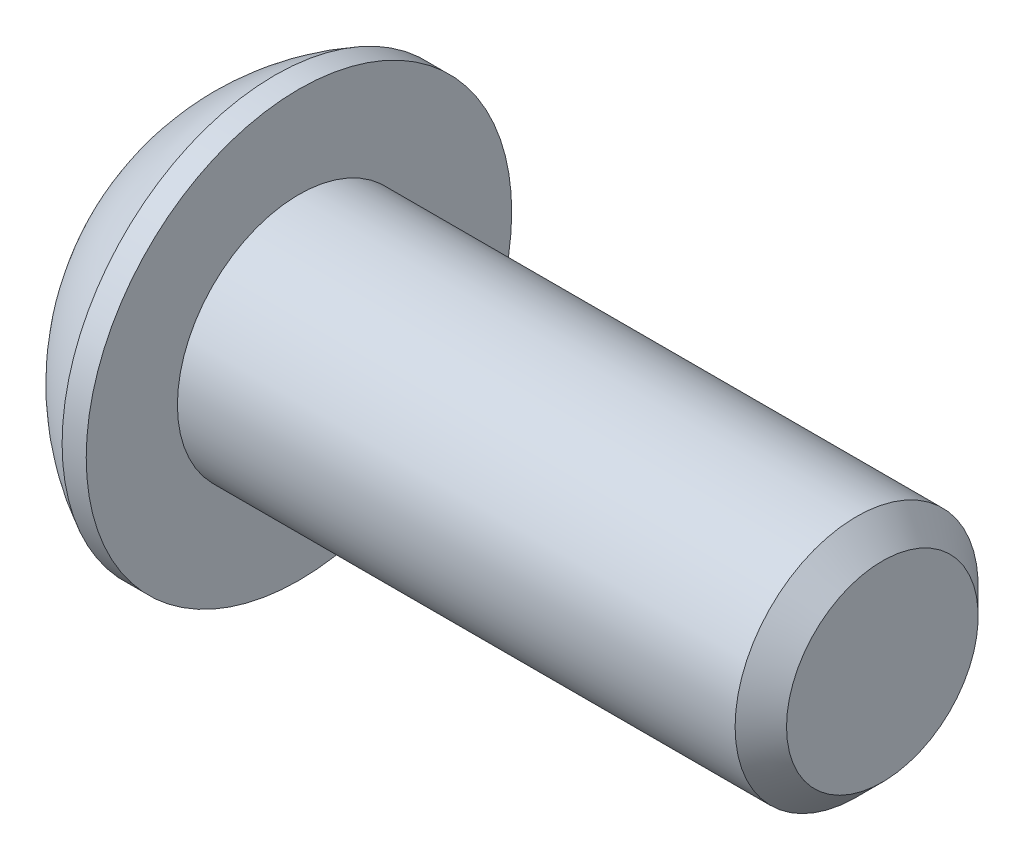
ISO-10303-21;
HEADER;
FILE_DESCRIPTION(('STEP AP214'),'2;1');
FILE_NAME('part.step','',(''),(''),'','','');
FILE_SCHEMA(('AUTOMOTIVE_DESIGN { 1 0 10303 214 1 1 1 1 }'));
ENDSEC;
DATA;
#1=APPLICATION_CONTEXT('core data for automotive mechanical design processes');
#2=APPLICATION_PROTOCOL_DEFINITION('international standard','automotive_design',2000,#1);
#3=PRODUCT_CONTEXT('',#1,'mechanical');
#4=PRODUCT('Part','Part','',(#3));
#5=PRODUCT_RELATED_PRODUCT_CATEGORY('part','',(#4));
#6=PRODUCT_DEFINITION_FORMATION('','',#4);
#7=PRODUCT_DEFINITION_CONTEXT('part definition',#1,'design');
#8=PRODUCT_DEFINITION('design','',#6,#7);
#9=PRODUCT_DEFINITION_SHAPE('','',#8);
#10=(LENGTH_UNIT() NAMED_UNIT(*) SI_UNIT(.MILLI.,.METRE.));
#11=(NAMED_UNIT(*) PLANE_ANGLE_UNIT() SI_UNIT($,.RADIAN.));
#12=(NAMED_UNIT(*) SI_UNIT($,.STERADIAN.) SOLID_ANGLE_UNIT());
#13=UNCERTAINTY_MEASURE_WITH_UNIT(LENGTH_MEASURE(1.E-05),#10,'distance_accuracy_value','');
#14=(GEOMETRIC_REPRESENTATION_CONTEXT(3) GLOBAL_UNCERTAINTY_ASSIGNED_CONTEXT((#13)) GLOBAL_UNIT_ASSIGNED_CONTEXT((#10,
#11,#12)) REPRESENTATION_CONTEXT('',''));
#15=CARTESIAN_POINT('',(0.,0.,0.));
#16=DIRECTION('',(0.,0.,1.));
#17=DIRECTION('',(1.,0.,0.));
#18=AXIS2_PLACEMENT_3D('',#15,#16,#17);
#19=CARTESIAN_POINT('',(0.,0.,0.));
#20=DIRECTION('',(-1.,0.,0.));
#21=DIRECTION('',(0.,0.,1.));
#22=AXIS2_PLACEMENT_3D('',#19,#20,#21);
#23=PLANE('',#22);
#24=CARTESIAN_POINT('',(0.,0.,0.));
#25=DIRECTION('',(-1.,0.,0.));
#26=DIRECTION('',(0.,0.,1.));
#27=AXIS2_PLACEMENT_3D('',#24,#25,#26);
#28=CIRCLE('',#27,3.47345);
#29=CARTESIAN_POINT('',(0.,3.47345,0.));
#30=VERTEX_POINT('',#29);
#31=EDGE_CURVE('E11',#30,#30,#28,.T.);
#32=ORIENTED_EDGE('',*,*,#31,.T.);
#33=EDGE_LOOP('',(#32));
#34=FACE_BOUND('',#33,.T.);
#35=DIRECTION('',(0.,-1.,0.));
#36=VECTOR('',#35,1.);
#37=CARTESIAN_POINT('',(0.,-1.37848150271715,2.3876));
#38=LINE('',#37,#36);
#39=CARTESIAN_POINT('',(0.,1.37848150271715,2.3876));
#40=VERTEX_POINT('',#39);
#41=CARTESIAN_POINT('',(0.,-1.37848150271715,2.3876));
#42=VERTEX_POINT('',#41);
#43=EDGE_CURVE('E49',#40,#42,#38,.T.);
#44=ORIENTED_EDGE('',*,*,#43,.T.);
#45=DIRECTION('',(0.,-0.5,-0.866025403784439));
#46=VECTOR('',#45,1.);
#47=CARTESIAN_POINT('',(0.,-2.7569630054343,0.));
#48=LINE('',#47,#46);
#49=CARTESIAN_POINT('',(0.,-2.7569630054343,0.));
#50=VERTEX_POINT('',#49);
#51=EDGE_CURVE('E106',#42,#50,#48,.T.);
#52=ORIENTED_EDGE('',*,*,#51,.T.);
#53=DIRECTION('',(0.,0.5,-0.866025403784439));
#54=VECTOR('',#53,1.);
#55=CARTESIAN_POINT('',(0.,-1.37848150271715,-2.3876));
#56=LINE('',#55,#54);
#57=CARTESIAN_POINT('',(0.,-1.37848150271715,-2.3876));
#58=VERTEX_POINT('',#57);
#59=EDGE_CURVE('E108',#50,#58,#56,.T.);
#60=ORIENTED_EDGE('',*,*,#59,.T.);
#61=DIRECTION('',(0.,1.,0.));
#62=VECTOR('',#61,1.);
#63=CARTESIAN_POINT('',(0.,1.37848150271715,-2.3876));
#64=LINE('',#63,#62);
#65=CARTESIAN_POINT('',(0.,1.37848150271715,-2.3876));
#66=VERTEX_POINT('',#65);
#67=EDGE_CURVE('E123',#58,#66,#64,.T.);
#68=ORIENTED_EDGE('',*,*,#67,.T.);
#69=DIRECTION('',(0.,0.5,0.866025403784439));
#70=VECTOR('',#69,1.);
#71=CARTESIAN_POINT('',(0.,2.7569630054343,0.));
#72=LINE('',#71,#70);
#73=CARTESIAN_POINT('',(0.,2.7569630054343,0.));
#74=VERTEX_POINT('',#73);
#75=EDGE_CURVE('E382',#66,#74,#72,.T.);
#76=ORIENTED_EDGE('',*,*,#75,.T.);
#77=DIRECTION('',(0.,-0.5,0.866025403784439));
#78=VECTOR('',#77,1.);
#79=CARTESIAN_POINT('',(0.,1.37848150271715,2.3876));
#80=LINE('',#79,#78);
#81=EDGE_CURVE('E383',#74,#40,#80,.T.);
#82=ORIENTED_EDGE('',*,*,#81,.T.);
#83=EDGE_LOOP('',(#44,#52,#60,#68,#76,#82));
#84=FACE_BOUND('',#83,.T.);
#85=ADVANCED_FACE('F35',(#34,#84),#23,.T.);
#86=CARTESIAN_POINT('',(6.99221430555556,0.,0.));
#87=DIRECTION('',(-1.,0.,0.));
#88=DIRECTION('',(0.,1.,0.));
#89=AXIS2_PLACEMENT_3D('',#86,#87,#88);
#90=SPHERICAL_SURFACE('',#89,7.80742696394375);
#91=CARTESIAN_POINT('',(3.429,0.,0.));
#92=DIRECTION('',(-1.,0.,0.));
#93=DIRECTION('',(0.,0.,1.));
#94=AXIS2_PLACEMENT_3D('',#91,#92,#93);
#95=CIRCLE('',#94,6.9469);
#96=CARTESIAN_POINT('',(3.429,6.9469,0.));
#97=VERTEX_POINT('',#96);
#98=EDGE_CURVE('E42',#97,#97,#95,.T.);
#99=CARTESIAN_POINT('',(3.429,6.9469,0.));
#100=CARTESIAN_POINT('',(3.38299028042981,6.9233007078748,0.));
#101=CARTESIAN_POINT('',(3.33721507803448,6.89924420277975,0.));
#102=CARTESIAN_POINT('',(3.24615162668048,6.8502265451056,0.));
#103=CARTESIAN_POINT('',(3.20086337772181,6.82526539252651,0.));
#104=CARTESIAN_POINT('',(3.11079175232804,6.77444821833994,0.));
#105=CARTESIAN_POINT('',(3.06600837589294,6.74859219673246,0.));
#106=CARTESIAN_POINT('',(2.97696416381529,6.69599551190484,0.));
#107=CARTESIAN_POINT('',(2.93270332817274,6.66925484868469,0.));
#108=CARTESIAN_POINT('',(2.84472167346736,6.61489943163715,0.));
#109=CARTESIAN_POINT('',(2.80100085440453,6.58728467780976,0.));
#110=CARTESIAN_POINT('',(2.71411649176496,6.53119198248872,0.));
#111=CARTESIAN_POINT('',(2.67095294818821,6.50271404099508,0.));
#112=CARTESIAN_POINT('',(2.58520017642221,6.44490621220259,0.));
#113=CARTESIAN_POINT('',(2.54261094823296,6.41557632490374,0.));
#114=CARTESIAN_POINT('',(2.45802362015506,6.35607618317822,0.));
#115=CARTESIAN_POINT('',(2.41602552026642,6.32590592875154,0.));
#116=CARTESIAN_POINT('',(2.33263702841404,6.26473696306766,0.));
#117=CARTESIAN_POINT('',(2.29124663645031,6.23373825181047,0.));
#118=CARTESIAN_POINT('',(2.20908990014782,6.17092460984857,0.));
#119=CARTESIAN_POINT('',(2.16832355580907,6.13910967914387,0.));
#120=CARTESIAN_POINT('',(2.08743100810617,6.07467615787982,0.));
#121=CARTESIAN_POINT('',(2.04730480474203,6.04205756732047,0.));
#122=CARTESIAN_POINT('',(1.96770837962786,5.97602960320368,0.));
#123=CARTESIAN_POINT('',(1.92823815787784,5.94262022964625,0.));
#124=CARTESIAN_POINT('',(1.84996927766961,5.87502388856695,0.));
#125=CARTESIAN_POINT('',(1.81117061921141,5.84083692104508,0.));
#126=CARTESIAN_POINT('',(1.7342601821511,5.77169888804188,0.));
#127=CARTESIAN_POINT('',(1.69614840354898,5.73674782256055,0.));
#128=CARTESIAN_POINT('',(1.62062677160525,5.66609539128663,0.));
#129=CARTESIAN_POINT('',(1.58321691826364,5.63039402549405,0.));
#130=CARTESIAN_POINT('',(1.50911390514594,5.55825508744226,0.));
#131=CARTESIAN_POINT('',(1.47242074536987,5.52181751518306,0.));
#132=CARTESIAN_POINT('',(1.39976560475885,5.44822054867524,0.));
#133=CARTESIAN_POINT('',(1.36380362392392,5.41106115442662,0.));
#134=CARTESIAN_POINT('',(1.29262503792293,5.33603521337114,0.));
#135=CARTESIAN_POINT('',(1.25740843275688,5.29816866656429,0.));
#136=CARTESIAN_POINT('',(1.18773450056911,5.22174336898649,0.));
#137=CARTESIAN_POINT('',(1.1532771735474,5.18318461821554,0.));
#138=CARTESIAN_POINT('',(1.08513540038319,5.10539013456538,0.));
#139=CARTESIAN_POINT('',(1.05145095424068,5.06615440168615,0.));
#140=CARTESIAN_POINT('',(0.984868240459227,4.98702144292777,0.));
#141=CARTESIAN_POINT('',(0.951969972820287,4.9471242170486,0.));
#142=CARTESIAN_POINT('',(0.886972603310109,4.86668402253665,0.));
#143=CARTESIAN_POINT('',(0.854873501438872,4.82614105390387,0.));
#144=CARTESIAN_POINT('',(0.791487135241879,4.74442537905081,0.));
#145=CARTESIAN_POINT('',(0.760199870916124,4.70325267283054,0.));
#146=CARTESIAN_POINT('',(0.698449531095837,4.62029377657177,0.));
#147=CARTESIAN_POINT('',(0.667986455601305,4.57850758653328,0.));
#148=CARTESIAN_POINT('',(0.607896519373352,4.49433821858763,0.));
#149=CARTESIAN_POINT('',(0.578269658639931,4.45195504068048,0.));
#150=CARTESIAN_POINT('',(0.519863847715544,4.36660842863888,0.));
#151=CARTESIAN_POINT('',(0.491084897524578,4.32364499450442,0.));
#152=CARTESIAN_POINT('',(0.434386268869488,4.23715483064814,0.));
#153=CARTESIAN_POINT('',(0.406466590405363,4.19362810092632,0.));
#154=CARTESIAN_POINT('',(0.351497526676594,4.10602852916683,0.));
#155=CARTESIAN_POINT('',(0.32444814141195,4.06195568712916,0.));
#156=CARTESIAN_POINT('',(0.271230343842259,3.9732812886314,0.));
#157=CARTESIAN_POINT('',(0.245061931537212,3.92867973217131,0.));
#158=CARTESIAN_POINT('',(0.193616404947283,3.83896551505233,0.));
#159=CARTESIAN_POINT('',(0.1683392906624,3.79385285439345,0.));
#160=CARTESIAN_POINT('',(0.118686359131506,3.70313422739892,0.));
#161=CARTESIAN_POINT('',(0.0943105418854947,3.65752826106327,0.));
#162=CARTESIAN_POINT('',(0.0464697512979692,3.56584106625221,0.));
#163=CARTESIAN_POINT('',(0.0230047779564549,3.51975983777679,0.));
#164=CARTESIAN_POINT('',(0.,3.47345,0.));
#165=B_SPLINE_CURVE_WITH_KNOTS('',3,(#99,#100,#101,#102,#103,#104,#105,#106,#107,#108,#109,#110,
#111,#112,#113,#114,#115,#116,#117,#118,#119,#120,#121,#122,#123,#124,#125,#126,#127,#128,#129,
#130,#131,#132,#133,#134,#135,#136,#137,#138,#139,#140,#141,#142,#143,#144,#145,#146,#147,#148,
#149,#150,#151,#152,#153,#154,#155,#156,#157,#158,#159,#160,#161,#162,#163,#164),.UNSPECIFIED.,
.F.,.F.,(4,2,2,2,2,2,2,2,2,2,2,2,2,2,2,2,2,2,2,2,2,2,2,2,2,2,2,2,2,2,2,2,4),(0.,
0.155124449954781,0.310248899909562,0.465373349864342,0.620497799819123,0.775622249773904,
0.930746699728683,1.08587114968346,1.24099559963825,1.39612004959303,1.55124449954781,
1.70636894950259,1.86149339945737,2.01661784941215,2.17174229936693,2.32686674932171,
2.48199119927649,2.63711564923127,2.79224009918605,2.94736454914083,3.10248899909561,
3.25761344905039,3.41273789900518,3.56786234895996,3.72298679891474,3.87811124886952,
4.0332356988243,4.18836014877908,4.34348459873386,4.49860904868864,4.65373349864342,
4.8088579485982,4.96398239855298),.UNSPECIFIED.);
#166=EDGE_CURVE('BSEAM156',#97,#30,#165,.T.);
#167=ORIENTED_EDGE('',*,*,#98,.T.);
#168=ORIENTED_EDGE('',*,*,#31,.F.);
#169=ORIENTED_EDGE('',*,*,#166,.T.);
#170=ORIENTED_EDGE('',*,*,#166,.F.);
#171=EDGE_LOOP('',(#167,#169,#168,#170));
#172=FACE_BOUND('',#171,.T.);
#173=ADVANCED_FACE('F156',(#172),#90,.T.);
#174=CARTESIAN_POINT('',(0.,0.,0.));
#175=DIRECTION('',(-1.,0.,0.));
#176=DIRECTION('',(0.,0.,1.));
#177=AXIS2_PLACEMENT_3D('',#174,#175,#176);
#178=CYLINDRICAL_SURFACE('',#177,6.9469);
#179=ORIENTED_EDGE('',*,*,#98,.F.);
#180=EDGE_LOOP('',(#179));
#181=FACE_BOUND('',#180,.T.);
#182=CARTESIAN_POINT('',(4.2164,0.,0.));
#183=DIRECTION('',(-1.,0.,0.));
#184=DIRECTION('',(0.,0.,1.));
#185=AXIS2_PLACEMENT_3D('',#182,#183,#184);
#186=CIRCLE('',#185,6.9469);
#187=CARTESIAN_POINT('',(4.2164,0.,6.9469));
#188=VERTEX_POINT('',#187);
#189=EDGE_CURVE('E151',#188,#188,#186,.T.);
#190=ORIENTED_EDGE('',*,*,#189,.T.);
#191=EDGE_LOOP('',(#190));
#192=FACE_BOUND('',#191,.T.);
#193=ADVANCED_FACE('F159',(#181,#192),#178,.T.);
#194=CARTESIAN_POINT('',(4.2164,3.96875,0.));
#195=DIRECTION('',(-1.,0.,0.));
#196=DIRECTION('',(0.,0.,1.));
#197=AXIS2_PLACEMENT_3D('',#194,#195,#196);
#198=PLANE('',#197);
#199=ORIENTED_EDGE('',*,*,#189,.F.);
#200=EDGE_LOOP('',(#199));
#201=FACE_BOUND('',#200,.T.);
#202=CARTESIAN_POINT('',(4.2164,0.,0.));
#203=DIRECTION('',(-1.,0.,0.));
#204=DIRECTION('',(0.,0.,1.));
#205=AXIS2_PLACEMENT_3D('',#202,#203,#204);
#206=CIRCLE('',#205,3.96875);
#207=CARTESIAN_POINT('',(4.2164,0.,3.96875));
#208=VERTEX_POINT('',#207);
#209=EDGE_CURVE('E148',#208,#208,#206,.T.);
#210=ORIENTED_EDGE('',*,*,#209,.T.);
#211=EDGE_LOOP('',(#210));
#212=FACE_BOUND('',#211,.T.);
#213=ADVANCED_FACE('F162',(#201,#212),#198,.F.);
#214=CARTESIAN_POINT('',(0.,0.,0.));
#215=DIRECTION('',(-1.,0.,0.));
#216=DIRECTION('',(0.,0.,1.));
#217=AXIS2_PLACEMENT_3D('',#214,#215,#216);
#218=CYLINDRICAL_SURFACE('',#217,3.96875);
#219=ORIENTED_EDGE('',*,*,#209,.F.);
#220=EDGE_LOOP('',(#219));
#221=FACE_BOUND('',#220,.T.);
#222=CARTESIAN_POINT('',(22.42693,0.,0.));
#223=DIRECTION('',(-1.,0.,0.));
#224=DIRECTION('',(0.,0.,1.));
#225=AXIS2_PLACEMENT_3D('',#222,#223,#224);
#226=CIRCLE('',#225,3.96875);
#227=CARTESIAN_POINT('',(22.42693,0.,3.96875));
#228=VERTEX_POINT('',#227);
#229=EDGE_CURVE('E145',#228,#228,#226,.T.);
#230=ORIENTED_EDGE('',*,*,#229,.T.);
#231=EDGE_LOOP('',(#230));
#232=FACE_BOUND('',#231,.T.);
#233=ADVANCED_FACE('F168',(#221,#232),#218,.T.);
#234=CARTESIAN_POINT('',(23.2664,0.,0.));
#235=DIRECTION('',(-1.,0.,0.));
#236=DIRECTION('',(0.,0.,1.));
#237=AXIS2_PLACEMENT_3D('',#234,#235,#236);
#238=CONICAL_SURFACE('',#237,3.12928,0.78539816339744);
#239=ORIENTED_EDGE('',*,*,#229,.F.);
#240=EDGE_LOOP('',(#239));
#241=FACE_BOUND('',#240,.T.);
#242=CARTESIAN_POINT('',(23.2664,0.,0.));
#243=DIRECTION('',(-1.,0.,0.));
#244=DIRECTION('',(0.,0.,1.));
#245=AXIS2_PLACEMENT_3D('',#242,#243,#244);
#246=CIRCLE('',#245,3.12928);
#247=CARTESIAN_POINT('',(23.2664,0.,3.12928));
#248=VERTEX_POINT('',#247);
#249=EDGE_CURVE('E141',#248,#248,#246,.T.);
#250=ORIENTED_EDGE('',*,*,#249,.T.);
#251=EDGE_LOOP('',(#250));
#252=FACE_BOUND('',#251,.T.);
#253=ADVANCED_FACE('F174',(#241,#252),#238,.T.);
#254=CARTESIAN_POINT('',(23.2664,0.,0.));
#255=DIRECTION('',(-1.,0.,0.));
#256=DIRECTION('',(0.,0.,1.));
#257=AXIS2_PLACEMENT_3D('',#254,#255,#256);
#258=PLANE('',#257);
#259=ORIENTED_EDGE('',*,*,#249,.F.);
#260=EDGE_LOOP('',(#259));
#261=FACE_BOUND('',#260,.T.);
#262=ADVANCED_FACE('F180',(#261),#258,.F.);
#263=CARTESIAN_POINT('',(2.667,-2.7569630054343,0.));
#264=DIRECTION('',(0.,0.866025403784439,-0.5));
#265=DIRECTION('',(0.,0.5,0.866025403784439));
#266=AXIS2_PLACEMENT_3D('',#263,#264,#265);
#267=PLANE('',#266);
#268=DIRECTION('',(0.,-0.5,-0.866025403784439));
#269=VECTOR('',#268,1.);
#270=CARTESIAN_POINT('',(2.667,-2.7569630054343,0.));
#271=LINE('',#270,#269);
#272=CARTESIAN_POINT('',(2.667,-1.37848150271715,2.3876));
#273=VERTEX_POINT('',#272);
#274=CARTESIAN_POINT('',(2.667,-2.06772225407572,1.1938));
#275=VERTEX_POINT('',#274);
#276=EDGE_CURVE('E389',#273,#275,#271,.T.);
#277=ORIENTED_EDGE('',*,*,#276,.T.);
#278=CARTESIAN_POINT('',(2.667,-2.7569630054343,0.));
#279=VERTEX_POINT('',#278);
#280=EDGE_CURVE('E128',#275,#279,#271,.T.);
#281=ORIENTED_EDGE('',*,*,#280,.T.);
#282=DIRECTION('',(-1.,0.,0.));
#283=VECTOR('',#282,1.);
#284=CARTESIAN_POINT('',(2.667,-2.7569630054343,0.));
#285=LINE('',#284,#283);
#286=EDGE_CURVE('E119',#279,#50,#285,.T.);
#287=ORIENTED_EDGE('',*,*,#286,.T.);
#288=ORIENTED_EDGE('',*,*,#51,.F.);
#289=DIRECTION('',(-1.,0.,0.));
#290=VECTOR('',#289,1.);
#291=CARTESIAN_POINT('',(2.667,-1.37848150271715,2.3876));
#292=LINE('',#291,#290);
#293=EDGE_CURVE('E370',#273,#42,#292,.T.);
#294=ORIENTED_EDGE('',*,*,#293,.F.);
#295=EDGE_LOOP('',(#277,#281,#287,#288,#294));
#296=FACE_BOUND('',#295,.T.);
#297=ADVANCED_FACE('F126',(#296),#267,.T.);
#298=CARTESIAN_POINT('',(2.667,-1.37848150271715,-2.3876));
#299=DIRECTION('',(0.,0.866025403784439,0.5));
#300=DIRECTION('',(0.,-0.5,0.866025403784439));
#301=AXIS2_PLACEMENT_3D('',#298,#299,#300);
#302=PLANE('',#301);
#303=DIRECTION('',(0.,0.5,-0.866025403784439));
#304=VECTOR('',#303,1.);
#305=CARTESIAN_POINT('',(2.667,-1.37848150271715,-2.3876));
#306=LINE('',#305,#304);
#307=CARTESIAN_POINT('',(2.667,-2.06772225407572,-1.1938));
#308=VERTEX_POINT('',#307);
#309=EDGE_CURVE('E392',#279,#308,#306,.T.);
#310=ORIENTED_EDGE('',*,*,#309,.T.);
#311=CARTESIAN_POINT('',(2.667,-1.37848150271715,-2.3876));
#312=VERTEX_POINT('',#311);
#313=EDGE_CURVE('E391',#308,#312,#306,.T.);
#314=ORIENTED_EDGE('',*,*,#313,.T.);
#315=DIRECTION('',(-1.,0.,0.));
#316=VECTOR('',#315,1.);
#317=CARTESIAN_POINT('',(2.667,-1.37848150271715,-2.3876));
#318=LINE('',#317,#316);
#319=EDGE_CURVE('E121',#312,#58,#318,.T.);
#320=ORIENTED_EDGE('',*,*,#319,.T.);
#321=ORIENTED_EDGE('',*,*,#59,.F.);
#322=ORIENTED_EDGE('',*,*,#286,.F.);
#323=EDGE_LOOP('',(#310,#314,#320,#321,#322));
#324=FACE_BOUND('',#323,.T.);
#325=ADVANCED_FACE('F118',(#324),#302,.T.);
#326=CARTESIAN_POINT('',(2.667,1.37848150271715,-2.3876));
#327=DIRECTION('',(0.,0.,1.));
#328=DIRECTION('',(1.,0.,0.));
#329=AXIS2_PLACEMENT_3D('',#326,#327,#328);
#330=PLANE('',#329);
#331=DIRECTION('',(0.,1.,0.));
#332=VECTOR('',#331,1.);
#333=CARTESIAN_POINT('',(2.667,1.37848150271715,-2.3876));
#334=LINE('',#333,#332);
#335=CARTESIAN_POINT('',(2.667,0.,-2.3876));
#336=VERTEX_POINT('',#335);
#337=EDGE_CURVE('E393',#312,#336,#334,.T.);
#338=ORIENTED_EDGE('',*,*,#337,.T.);
#339=CARTESIAN_POINT('',(2.667,1.37848150271715,-2.3876));
#340=VERTEX_POINT('',#339);
#341=EDGE_CURVE('E379',#336,#340,#334,.T.);
#342=ORIENTED_EDGE('',*,*,#341,.T.);
#343=DIRECTION('',(-1.,0.,0.));
#344=VECTOR('',#343,1.);
#345=CARTESIAN_POINT('',(2.667,1.37848150271715,-2.3876));
#346=LINE('',#345,#344);
#347=EDGE_CURVE('E136',#340,#66,#346,.T.);
#348=ORIENTED_EDGE('',*,*,#347,.T.);
#349=ORIENTED_EDGE('',*,*,#67,.F.);
#350=ORIENTED_EDGE('',*,*,#319,.F.);
#351=EDGE_LOOP('',(#338,#342,#348,#349,#350));
#352=FACE_BOUND('',#351,.T.);
#353=ADVANCED_FACE('F242',(#352),#330,.T.);
#354=CARTESIAN_POINT('',(2.667,2.7569630054343,0.));
#355=DIRECTION('',(0.,-0.866025403784439,0.5));
#356=DIRECTION('',(0.,-0.5,-0.866025403784439));
#357=AXIS2_PLACEMENT_3D('',#354,#355,#356);
#358=PLANE('',#357);
#359=DIRECTION('',(0.,0.5,0.866025403784439));
#360=VECTOR('',#359,1.);
#361=CARTESIAN_POINT('',(2.667,2.7569630054343,0.));
#362=LINE('',#361,#360);
#363=CARTESIAN_POINT('',(2.667,2.06772225407573,-1.1938));
#364=VERTEX_POINT('',#363);
#365=EDGE_CURVE('E357',#340,#364,#362,.T.);
#366=ORIENTED_EDGE('',*,*,#365,.T.);
#367=CARTESIAN_POINT('',(2.667,2.7569630054343,0.));
#368=VERTEX_POINT('',#367);
#369=EDGE_CURVE('E394',#364,#368,#362,.T.);
#370=ORIENTED_EDGE('',*,*,#369,.T.);
#371=DIRECTION('',(-1.,0.,0.));
#372=VECTOR('',#371,1.);
#373=CARTESIAN_POINT('',(2.667,2.7569630054343,0.));
#374=LINE('',#373,#372);
#375=EDGE_CURVE('E363',#368,#74,#374,.T.);
#376=ORIENTED_EDGE('',*,*,#375,.T.);
#377=ORIENTED_EDGE('',*,*,#75,.F.);
#378=ORIENTED_EDGE('',*,*,#347,.F.);
#379=EDGE_LOOP('',(#366,#370,#376,#377,#378));
#380=FACE_BOUND('',#379,.T.);
#381=ADVANCED_FACE('F251',(#380),#358,.T.);
#382=CARTESIAN_POINT('',(2.667,1.37848150271715,2.3876));
#383=DIRECTION('',(0.,-0.866025403784439,-0.5));
#384=DIRECTION('',(0.,0.5,-0.866025403784439));
#385=AXIS2_PLACEMENT_3D('',#382,#383,#384);
#386=PLANE('',#385);
#387=DIRECTION('',(0.,-0.5,0.866025403784439));
#388=VECTOR('',#387,1.);
#389=CARTESIAN_POINT('',(2.667,1.37848150271715,2.3876));
#390=LINE('',#389,#388);
#391=CARTESIAN_POINT('',(2.667,2.06772225407573,1.1938));
#392=VERTEX_POINT('',#391);
#393=EDGE_CURVE('E356',#368,#392,#390,.T.);
#394=ORIENTED_EDGE('',*,*,#393,.T.);
#395=CARTESIAN_POINT('',(2.667,1.37848150271715,2.3876));
#396=VERTEX_POINT('',#395);
#397=EDGE_CURVE('E353',#392,#396,#390,.T.);
#398=ORIENTED_EDGE('',*,*,#397,.T.);
#399=DIRECTION('',(-1.,0.,0.));
#400=VECTOR('',#399,1.);
#401=CARTESIAN_POINT('',(2.667,1.37848150271715,2.3876));
#402=LINE('',#401,#400);
#403=EDGE_CURVE('E372',#396,#40,#402,.T.);
#404=ORIENTED_EDGE('',*,*,#403,.T.);
#405=ORIENTED_EDGE('',*,*,#81,.F.);
#406=ORIENTED_EDGE('',*,*,#375,.F.);
#407=EDGE_LOOP('',(#394,#398,#404,#405,#406));
#408=FACE_BOUND('',#407,.T.);
#409=ADVANCED_FACE('F261',(#408),#386,.T.);
#410=CARTESIAN_POINT('',(2.667,-1.37848150271715,2.3876));
#411=DIRECTION('',(0.,0.,-1.));
#412=DIRECTION('',(-1.,0.,0.));
#413=AXIS2_PLACEMENT_3D('',#410,#411,#412);
#414=PLANE('',#413);
#415=DIRECTION('',(0.,-1.,0.));
#416=VECTOR('',#415,1.);
#417=CARTESIAN_POINT('',(2.667,-1.37848150271715,2.3876));
#418=LINE('',#417,#416);
#419=CARTESIAN_POINT('',(2.667,0.,2.3876));
#420=VERTEX_POINT('',#419);
#421=EDGE_CURVE('E57',#396,#420,#418,.T.);
#422=ORIENTED_EDGE('',*,*,#421,.T.);
#423=EDGE_CURVE('E365',#420,#273,#418,.T.);
#424=ORIENTED_EDGE('',*,*,#423,.T.);
#425=ORIENTED_EDGE('',*,*,#293,.T.);
#426=ORIENTED_EDGE('',*,*,#43,.F.);
#427=ORIENTED_EDGE('',*,*,#403,.F.);
#428=EDGE_LOOP('',(#422,#424,#425,#426,#427));
#429=FACE_BOUND('',#428,.T.);
#430=ADVANCED_FACE('F271',(#429),#414,.T.);
#431=CARTESIAN_POINT('',(2.667,-1.37848150271715,2.3876));
#432=DIRECTION('',(-1.,0.,0.));
#433=DIRECTION('',(0.,0.,1.));
#434=AXIS2_PLACEMENT_3D('',#431,#432,#433);
#435=PLANE('',#434);
#436=ORIENTED_EDGE('',*,*,#421,.F.);
#437=ORIENTED_EDGE('',*,*,#397,.F.);
#438=CARTESIAN_POINT('',(2.667,0.,0.));
#439=DIRECTION('',(-1.,0.,0.));
#440=DIRECTION('',(0.,0.,1.));
#441=AXIS2_PLACEMENT_3D('',#438,#439,#440);
#442=CIRCLE('',#441,2.3876);
#443=EDGE_CURVE('E135',#420,#392,#442,.T.);
#444=ORIENTED_EDGE('',*,*,#443,.F.);
#445=EDGE_LOOP('',(#436,#437,#444));
#446=FACE_BOUND('',#445,.T.);
#447=ADVANCED_FACE('F281',(#446),#435,.T.);
#448=ORIENTED_EDGE('',*,*,#393,.F.);
#449=ORIENTED_EDGE('',*,*,#369,.F.);
#450=EDGE_CURVE('E142',#392,#364,#442,.T.);
#451=ORIENTED_EDGE('',*,*,#450,.F.);
#452=EDGE_LOOP('',(#448,#449,#451));
#453=FACE_BOUND('',#452,.T.);
#454=ADVANCED_FACE('F290',(#453),#435,.T.);
#455=ORIENTED_EDGE('',*,*,#365,.F.);
#456=ORIENTED_EDGE('',*,*,#341,.F.);
#457=EDGE_CURVE('E396',#364,#336,#442,.T.);
#458=ORIENTED_EDGE('',*,*,#457,.F.);
#459=EDGE_LOOP('',(#455,#456,#458));
#460=FACE_BOUND('',#459,.T.);
#461=ADVANCED_FACE('F301',(#460),#435,.T.);
#462=ORIENTED_EDGE('',*,*,#337,.F.);
#463=ORIENTED_EDGE('',*,*,#313,.F.);
#464=EDGE_CURVE('E398',#336,#308,#442,.T.);
#465=ORIENTED_EDGE('',*,*,#464,.F.);
#466=EDGE_LOOP('',(#462,#463,#465));
#467=FACE_BOUND('',#466,.T.);
#468=ADVANCED_FACE('F310',(#467),#435,.T.);
#469=ORIENTED_EDGE('',*,*,#309,.F.);
#470=ORIENTED_EDGE('',*,*,#280,.F.);
#471=EDGE_CURVE('E133',#308,#275,#442,.T.);
#472=ORIENTED_EDGE('',*,*,#471,.F.);
#473=EDGE_LOOP('',(#469,#470,#472));
#474=FACE_BOUND('',#473,.T.);
#475=ADVANCED_FACE('F319',(#474),#435,.T.);
#476=ORIENTED_EDGE('',*,*,#276,.F.);
#477=ORIENTED_EDGE('',*,*,#423,.F.);
#478=EDGE_CURVE('E130',#275,#420,#442,.T.);
#479=ORIENTED_EDGE('',*,*,#478,.F.);
#480=EDGE_LOOP('',(#476,#477,#479));
#481=FACE_BOUND('',#480,.T.);
#482=ADVANCED_FACE('F293',(#481),#435,.T.);
#483=CARTESIAN_POINT('',(4.04548150271717,0.,0.));
#484=DIRECTION('',(-1.,0.,0.));
#485=DIRECTION('',(0.,0.,1.));
#486=AXIS2_PLACEMENT_3D('',#483,#484,#485);
#487=CONICAL_SURFACE('',#486,0.,1.04719755119659);
#488=ORIENTED_EDGE('',*,*,#443,.T.);
#489=ORIENTED_EDGE('',*,*,#450,.T.);
#490=ORIENTED_EDGE('',*,*,#457,.T.);
#491=ORIENTED_EDGE('',*,*,#464,.T.);
#492=ORIENTED_EDGE('',*,*,#471,.T.);
#493=ORIENTED_EDGE('',*,*,#478,.T.);
#494=EDGE_LOOP('',(#488,#489,#490,#491,#492,#493));
#495=FACE_BOUND('',#494,.T.);
#496=CARTESIAN_POINT('',(4.04548150271717,0.,0.));
#497=VERTEX_POINT('',#496);
#498=VERTEX_LOOP('',#497);
#499=FACE_BOUND('',#498,.T.);
#500=ADVANCED_FACE('F336',(#495,#499),#487,.F.);
#501=CLOSED_SHELL('',(#85,#173,#193,#213,#233,#253,#262,#297,#325,#353,#381,#409,#430,#447,#454,
#461,#468,#475,#482,#500));
#502=MANIFOLD_SOLID_BREP('B2',#501);
#503=ADVANCED_BREP_SHAPE_REPRESENTATION('',(#18,#502),#14);
#504=SHAPE_DEFINITION_REPRESENTATION(#9,#503);
ENDSEC;
END-ISO-10303-21;
